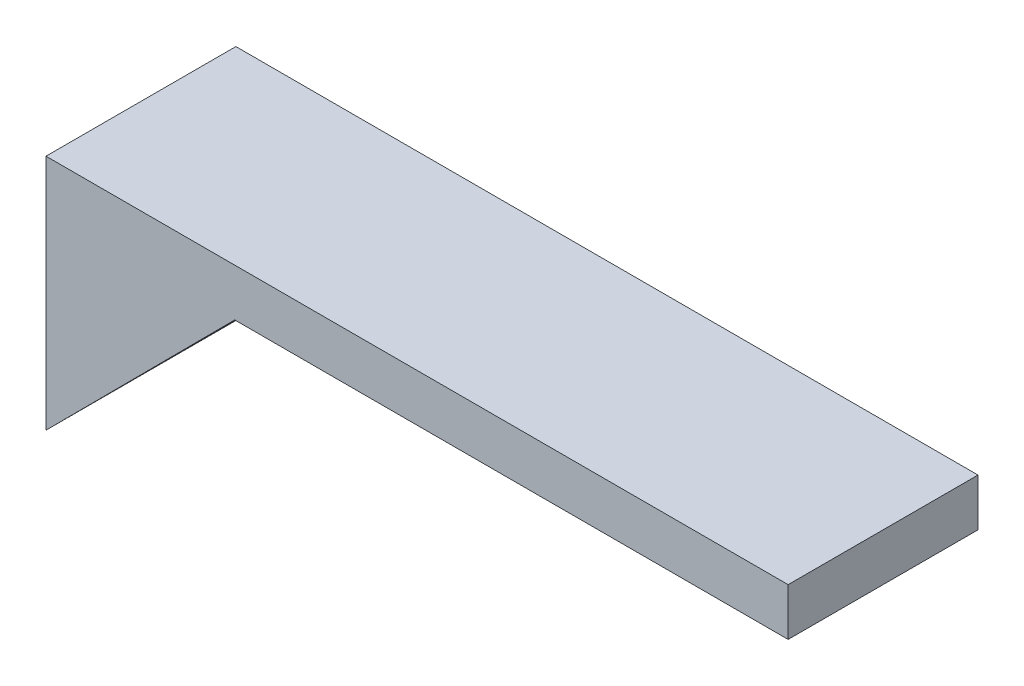
ISO-10303-21;
HEADER;
FILE_DESCRIPTION(('STEP AP214'),'2;1');
FILE_NAME('part.step','',(''),(''),'','','');
FILE_SCHEMA(('AUTOMOTIVE_DESIGN { 1 0 10303 214 1 1 1 1 }'));
ENDSEC;
DATA;
#1=APPLICATION_CONTEXT('core data for automotive mechanical design processes');
#2=APPLICATION_PROTOCOL_DEFINITION('international standard','automotive_design',2000,#1);
#3=PRODUCT_CONTEXT('',#1,'mechanical');
#4=PRODUCT('Part','Part','',(#3));
#5=PRODUCT_RELATED_PRODUCT_CATEGORY('part','',(#4));
#6=PRODUCT_DEFINITION_FORMATION('','',#4);
#7=PRODUCT_DEFINITION_CONTEXT('part definition',#1,'design');
#8=PRODUCT_DEFINITION('design','',#6,#7);
#9=PRODUCT_DEFINITION_SHAPE('','',#8);
#10=(LENGTH_UNIT() NAMED_UNIT(*) SI_UNIT(.MILLI.,.METRE.));
#11=(NAMED_UNIT(*) PLANE_ANGLE_UNIT() SI_UNIT($,.RADIAN.));
#12=(NAMED_UNIT(*) SI_UNIT($,.STERADIAN.) SOLID_ANGLE_UNIT());
#13=UNCERTAINTY_MEASURE_WITH_UNIT(LENGTH_MEASURE(1.E-05),#10,'distance_accuracy_value','');
#14=(GEOMETRIC_REPRESENTATION_CONTEXT(3) GLOBAL_UNCERTAINTY_ASSIGNED_CONTEXT((#13)) GLOBAL_UNIT_ASSIGNED_CONTEXT((#10,
#11,#12)) REPRESENTATION_CONTEXT('',''));
#15=CARTESIAN_POINT('',(0.,0.,0.));
#16=DIRECTION('',(0.,0.,1.));
#17=DIRECTION('',(1.,0.,0.));
#18=AXIS2_PLACEMENT_3D('',#15,#16,#17);
#19=CARTESIAN_POINT('',(99.287422199517,6.35000000000001,25.4));
#20=DIRECTION('',(1.,0.,0.));
#21=DIRECTION('',(0.,0.,-1.));
#22=AXIS2_PLACEMENT_3D('',#19,#20,#21);
#23=PLANE('',#22);
#24=DIRECTION('',(0.,-1.,0.));
#25=VECTOR('',#24,1.);
#26=CARTESIAN_POINT('',(99.287422199517,6.35000000000001,0.));
#27=LINE('',#26,#25);
#28=CARTESIAN_POINT('',(99.287422199517,6.35000000000001,0.));
#29=VERTEX_POINT('',#28);
#30=CARTESIAN_POINT('',(99.287422199517,0.,0.));
#31=VERTEX_POINT('',#30);
#32=EDGE_CURVE('E122',#29,#31,#27,.T.);
#33=ORIENTED_EDGE('',*,*,#32,.F.);
#34=DIRECTION('',(0.,0.,-1.));
#35=VECTOR('',#34,1.);
#36=CARTESIAN_POINT('',(99.287422199517,6.35000000000001,25.4));
#37=LINE('',#36,#35);
#38=CARTESIAN_POINT('',(99.287422199517,6.35000000000001,25.4));
#39=VERTEX_POINT('',#38);
#40=EDGE_CURVE('E11',#39,#29,#37,.T.);
#41=ORIENTED_EDGE('',*,*,#40,.F.);
#42=DIRECTION('',(0.,-1.,0.));
#43=VECTOR('',#42,1.);
#44=CARTESIAN_POINT('',(99.287422199517,6.35000000000001,25.4));
#45=LINE('',#44,#43);
#46=CARTESIAN_POINT('',(99.287422199517,0.,25.4));
#47=VERTEX_POINT('',#46);
#48=EDGE_CURVE('E116',#39,#47,#45,.T.);
#49=ORIENTED_EDGE('',*,*,#48,.T.);
#50=DIRECTION('',(0.,0.,-1.));
#51=VECTOR('',#50,1.);
#52=CARTESIAN_POINT('',(99.287422199517,0.,25.4));
#53=LINE('',#52,#51);
#54=EDGE_CURVE('E42',#47,#31,#53,.T.);
#55=ORIENTED_EDGE('',*,*,#54,.T.);
#56=EDGE_LOOP('',(#33,#41,#49,#55));
#57=FACE_BOUND('',#56,.T.);
#58=ADVANCED_FACE('F39',(#57),#23,.T.);
#59=CARTESIAN_POINT('',(0.,6.35000000000001,25.4));
#60=DIRECTION('',(0.,1.,0.));
#61=DIRECTION('',(0.,0.,1.));
#62=AXIS2_PLACEMENT_3D('',#59,#60,#61);
#63=PLANE('',#62);
#64=DIRECTION('',(1.,0.,0.));
#65=VECTOR('',#64,1.);
#66=CARTESIAN_POINT('',(0.,6.35000000000001,0.));
#67=LINE('',#66,#65);
#68=CARTESIAN_POINT('',(0.,6.35000000000001,0.));
#69=VERTEX_POINT('',#68);
#70=EDGE_CURVE('E135',#69,#29,#67,.T.);
#71=ORIENTED_EDGE('',*,*,#70,.F.);
#72=DIRECTION('',(0.,0.,-1.));
#73=VECTOR('',#72,1.);
#74=CARTESIAN_POINT('',(0.,6.35000000000001,25.4));
#75=LINE('',#74,#73);
#76=CARTESIAN_POINT('',(0.,6.35000000000001,25.4));
#77=VERTEX_POINT('',#76);
#78=EDGE_CURVE('E49',#77,#69,#75,.T.);
#79=ORIENTED_EDGE('',*,*,#78,.F.);
#80=DIRECTION('',(1.,0.,0.));
#81=VECTOR('',#80,1.);
#82=CARTESIAN_POINT('',(0.,6.35000000000001,25.4));
#83=LINE('',#82,#81);
#84=EDGE_CURVE('E98',#77,#39,#83,.T.);
#85=ORIENTED_EDGE('',*,*,#84,.T.);
#86=ORIENTED_EDGE('',*,*,#40,.T.);
#87=EDGE_LOOP('',(#71,#79,#85,#86));
#88=FACE_BOUND('',#87,.T.);
#89=ADVANCED_FACE('F145',(#88),#63,.T.);
#90=CARTESIAN_POINT('',(0.,0.,25.4));
#91=DIRECTION('',(-1.,0.,0.));
#92=DIRECTION('',(0.,0.,1.));
#93=AXIS2_PLACEMENT_3D('',#90,#91,#92);
#94=PLANE('',#93);
#95=DIRECTION('',(0.,1.,0.));
#96=VECTOR('',#95,1.);
#97=CARTESIAN_POINT('',(0.,0.,0.));
#98=LINE('',#97,#96);
#99=CARTESIAN_POINT('',(0.,-25.4,0.));
#100=VERTEX_POINT('',#99);
#101=EDGE_CURVE('E104',#100,#69,#98,.T.);
#102=ORIENTED_EDGE('',*,*,#101,.F.);
#103=DIRECTION('',(0.,0.,-1.));
#104=VECTOR('',#103,1.);
#105=CARTESIAN_POINT('',(0.,-25.4,25.4));
#106=LINE('',#105,#104);
#107=CARTESIAN_POINT('',(0.,-25.4,25.4));
#108=VERTEX_POINT('',#107);
#109=EDGE_CURVE('E102',#108,#100,#106,.T.);
#110=ORIENTED_EDGE('',*,*,#109,.F.);
#111=DIRECTION('',(0.,-1.,0.));
#112=VECTOR('',#111,1.);
#113=CARTESIAN_POINT('',(0.,0.,25.4));
#114=LINE('',#113,#112);
#115=EDGE_CURVE('E92',#77,#108,#114,.T.);
#116=ORIENTED_EDGE('',*,*,#115,.F.);
#117=ORIENTED_EDGE('',*,*,#78,.T.);
#118=EDGE_LOOP('',(#102,#110,#116,#117));
#119=FACE_BOUND('',#118,.T.);
#120=ADVANCED_FACE('F103',(#119),#94,.T.);
#121=CARTESIAN_POINT('',(0.,-25.4,25.4));
#122=DIRECTION('',(-0.709219858156028,0.704987370664995,0.));
#123=DIRECTION('',(-0.704987370664995,-0.709219858156028,0.));
#124=AXIS2_PLACEMENT_3D('',#121,#122,#123);
#125=PLANE('',#124);
#126=DIRECTION('',(0.704987370664995,0.709219858156028,0.));
#127=VECTOR('',#126,1.);
#128=CARTESIAN_POINT('',(0.,-25.4,0.));
#129=LINE('',#128,#127);
#130=CARTESIAN_POINT('',(25.2484176929961,0.,0.));
#131=VERTEX_POINT('',#130);
#132=EDGE_CURVE('E130',#100,#131,#129,.T.);
#133=ORIENTED_EDGE('',*,*,#132,.T.);
#134=DIRECTION('',(0.,0.,-1.));
#135=VECTOR('',#134,1.);
#136=CARTESIAN_POINT('',(25.2484176929961,0.,25.4));
#137=LINE('',#136,#135);
#138=CARTESIAN_POINT('',(25.2484176929961,0.,25.4));
#139=VERTEX_POINT('',#138);
#140=EDGE_CURVE('E109',#139,#131,#137,.T.);
#141=ORIENTED_EDGE('',*,*,#140,.F.);
#142=DIRECTION('',(0.704987370664995,0.709219858156028,0.));
#143=VECTOR('',#142,1.);
#144=CARTESIAN_POINT('',(0.,-25.4,25.4));
#145=LINE('',#144,#143);
#146=EDGE_CURVE('E96',#108,#139,#145,.T.);
#147=ORIENTED_EDGE('',*,*,#146,.F.);
#148=ORIENTED_EDGE('',*,*,#109,.T.);
#149=EDGE_LOOP('',(#133,#141,#147,#148));
#150=FACE_BOUND('',#149,.T.);
#151=ADVANCED_FACE('F111',(#150),#125,.F.);
#152=CARTESIAN_POINT('',(99.287422199517,0.,25.4));
#153=DIRECTION('',(0.,-1.,0.));
#154=DIRECTION('',(0.,0.,-1.));
#155=AXIS2_PLACEMENT_3D('',#152,#153,#154);
#156=PLANE('',#155);
#157=DIRECTION('',(-1.,0.,0.));
#158=VECTOR('',#157,1.);
#159=CARTESIAN_POINT('',(99.287422199517,0.,0.));
#160=LINE('',#159,#158);
#161=EDGE_CURVE('E126',#31,#131,#160,.T.);
#162=ORIENTED_EDGE('',*,*,#161,.F.);
#163=ORIENTED_EDGE('',*,*,#54,.F.);
#164=DIRECTION('',(-1.,0.,0.));
#165=VECTOR('',#164,1.);
#166=CARTESIAN_POINT('',(99.287422199517,0.,25.4));
#167=LINE('',#166,#165);
#168=EDGE_CURVE('E113',#47,#139,#167,.T.);
#169=ORIENTED_EDGE('',*,*,#168,.T.);
#170=ORIENTED_EDGE('',*,*,#140,.T.);
#171=EDGE_LOOP('',(#162,#163,#169,#170));
#172=FACE_BOUND('',#171,.T.);
#173=ADVANCED_FACE('F142',(#172),#156,.T.);
#174=CARTESIAN_POINT('',(0.,0.,25.4));
#175=DIRECTION('',(0.,0.,-1.));
#176=DIRECTION('',(-1.,0.,0.));
#177=AXIS2_PLACEMENT_3D('',#174,#175,#176);
#178=PLANE('',#177);
#179=ORIENTED_EDGE('',*,*,#48,.F.);
#180=ORIENTED_EDGE('',*,*,#84,.F.);
#181=ORIENTED_EDGE('',*,*,#115,.T.);
#182=ORIENTED_EDGE('',*,*,#146,.T.);
#183=ORIENTED_EDGE('',*,*,#168,.F.);
#184=EDGE_LOOP('',(#179,#180,#181,#182,#183));
#185=FACE_BOUND('',#184,.T.);
#186=ADVANCED_FACE('F94',(#185),#178,.F.);
#187=CARTESIAN_POINT('',(0.,0.,0.));
#188=DIRECTION('',(0.,0.,-1.));
#189=DIRECTION('',(-1.,0.,0.));
#190=AXIS2_PLACEMENT_3D('',#187,#188,#189);
#191=PLANE('',#190);
#192=ORIENTED_EDGE('',*,*,#32,.T.);
#193=ORIENTED_EDGE('',*,*,#161,.T.);
#194=ORIENTED_EDGE('',*,*,#132,.F.);
#195=ORIENTED_EDGE('',*,*,#101,.T.);
#196=ORIENTED_EDGE('',*,*,#70,.T.);
#197=EDGE_LOOP('',(#192,#193,#194,#195,#196));
#198=FACE_BOUND('',#197,.T.);
#199=ADVANCED_FACE('F144',(#198),#191,.T.);
#200=CLOSED_SHELL('',(#58,#89,#120,#151,#173,#186,#199));
#201=MANIFOLD_SOLID_BREP('B2',#200);
#202=ADVANCED_BREP_SHAPE_REPRESENTATION('',(#18,#201),#14);
#203=SHAPE_DEFINITION_REPRESENTATION(#9,#202);
ENDSEC;
END-ISO-10303-21;
